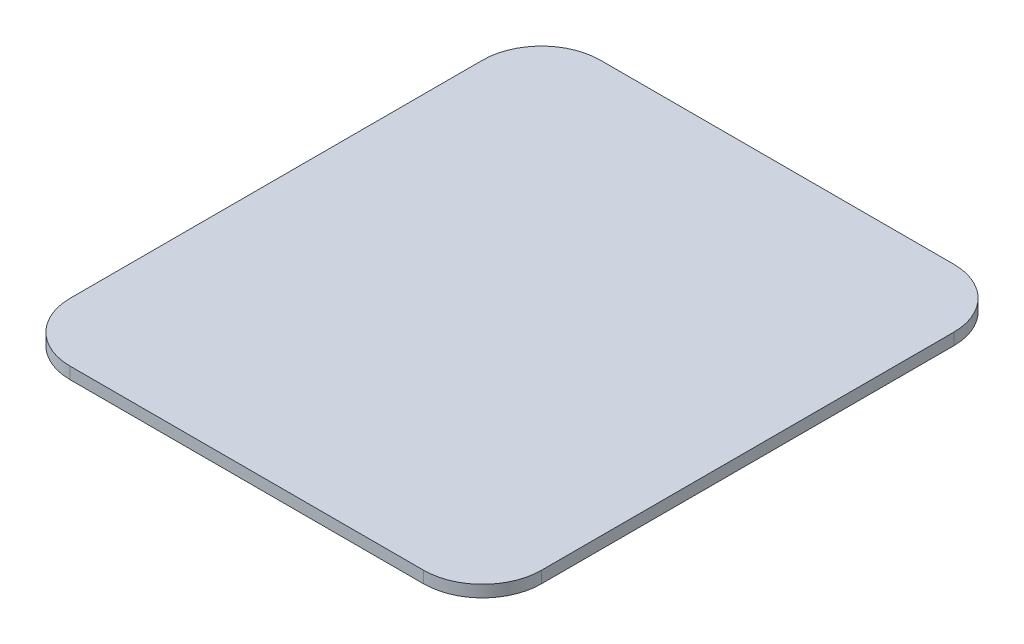
ISO-10303-21;
HEADER;
FILE_DESCRIPTION(('STEP AP214'),'2;1');
FILE_NAME('part.step','',(''),(''),'','','');
FILE_SCHEMA(('AUTOMOTIVE_DESIGN { 1 0 10303 214 1 1 1 1 }'));
ENDSEC;
DATA;
#1=APPLICATION_CONTEXT('core data for automotive mechanical design processes');
#2=APPLICATION_PROTOCOL_DEFINITION('international standard','automotive_design',2000,#1);
#3=PRODUCT_CONTEXT('',#1,'mechanical');
#4=PRODUCT('Part','Part','',(#3));
#5=PRODUCT_RELATED_PRODUCT_CATEGORY('part','',(#4));
#6=PRODUCT_DEFINITION_FORMATION('','',#4);
#7=PRODUCT_DEFINITION_CONTEXT('part definition',#1,'design');
#8=PRODUCT_DEFINITION('design','',#6,#7);
#9=PRODUCT_DEFINITION_SHAPE('','',#8);
#10=(LENGTH_UNIT() NAMED_UNIT(*) SI_UNIT(.MILLI.,.METRE.));
#11=(NAMED_UNIT(*) PLANE_ANGLE_UNIT() SI_UNIT($,.RADIAN.));
#12=(NAMED_UNIT(*) SI_UNIT($,.STERADIAN.) SOLID_ANGLE_UNIT());
#13=UNCERTAINTY_MEASURE_WITH_UNIT(LENGTH_MEASURE(1.E-05),#10,'distance_accuracy_value','');
#14=(GEOMETRIC_REPRESENTATION_CONTEXT(3) GLOBAL_UNCERTAINTY_ASSIGNED_CONTEXT((#13)) GLOBAL_UNIT_ASSIGNED_CONTEXT((#10,
#11,#12)) REPRESENTATION_CONTEXT('',''));
#15=CARTESIAN_POINT('',(0.,0.,0.));
#16=DIRECTION('',(0.,0.,1.));
#17=DIRECTION('',(1.,0.,0.));
#18=AXIS2_PLACEMENT_3D('',#15,#16,#17);
#19=CARTESIAN_POINT('',(-150.,10.,175.));
#20=DIRECTION('',(0.,-1.,0.));
#21=DIRECTION('',(0.,0.,-1.));
#22=AXIS2_PLACEMENT_3D('',#19,#20,#21);
#23=CYLINDRICAL_SURFACE('',#22,50.);
#24=CARTESIAN_POINT('',(-150.,0.,175.));
#25=DIRECTION('',(0.,1.,0.));
#26=DIRECTION('',(0.,0.,-1.));
#27=AXIS2_PLACEMENT_3D('',#24,#25,#26);
#28=CIRCLE('',#27,50.);
#29=CARTESIAN_POINT('',(-200.,0.,175.));
#30=VERTEX_POINT('',#29);
#31=CARTESIAN_POINT('',(-150.,0.,225.));
#32=VERTEX_POINT('',#31);
#33=EDGE_CURVE('E140',#30,#32,#28,.T.);
#34=ORIENTED_EDGE('',*,*,#33,.T.);
#35=DIRECTION('',(0.,-1.,0.));
#36=VECTOR('',#35,1.);
#37=CARTESIAN_POINT('',(-150.,10.,225.));
#38=LINE('',#37,#36);
#39=CARTESIAN_POINT('',(-150.,10.,225.));
#40=VERTEX_POINT('',#39);
#41=EDGE_CURVE('E11',#40,#32,#38,.T.);
#42=ORIENTED_EDGE('',*,*,#41,.F.);
#43=CARTESIAN_POINT('',(-150.,10.,175.));
#44=DIRECTION('',(0.,1.,0.));
#45=DIRECTION('',(0.,0.,-1.));
#46=AXIS2_PLACEMENT_3D('',#43,#44,#45);
#47=CIRCLE('',#46,50.);
#48=CARTESIAN_POINT('',(-200.,10.,175.));
#49=VERTEX_POINT('',#48);
#50=EDGE_CURVE('E162',#49,#40,#47,.T.);
#51=ORIENTED_EDGE('',*,*,#50,.F.);
#52=DIRECTION('',(0.,-1.,0.));
#53=VECTOR('',#52,1.);
#54=CARTESIAN_POINT('',(-200.,10.,175.));
#55=LINE('',#54,#53);
#56=EDGE_CURVE('E136',#49,#30,#55,.T.);
#57=ORIENTED_EDGE('',*,*,#56,.T.);
#58=EDGE_LOOP('',(#34,#42,#51,#57));
#59=FACE_BOUND('',#58,.T.);
#60=ADVANCED_FACE('F39',(#59),#23,.T.);
#61=CARTESIAN_POINT('',(-150.,10.,225.));
#62=DIRECTION('',(0.,0.,-1.));
#63=DIRECTION('',(-1.,0.,0.));
#64=AXIS2_PLACEMENT_3D('',#61,#62,#63);
#65=PLANE('',#64);
#66=DIRECTION('',(1.,0.,0.));
#67=VECTOR('',#66,1.);
#68=CARTESIAN_POINT('',(-150.,0.,225.));
#69=LINE('',#68,#67);
#70=CARTESIAN_POINT('',(150.,0.,225.));
#71=VERTEX_POINT('',#70);
#72=EDGE_CURVE('E144',#32,#71,#69,.T.);
#73=ORIENTED_EDGE('',*,*,#72,.T.);
#74=DIRECTION('',(0.,-1.,0.));
#75=VECTOR('',#74,1.);
#76=CARTESIAN_POINT('',(150.,10.,225.));
#77=LINE('',#76,#75);
#78=CARTESIAN_POINT('',(150.,10.,225.));
#79=VERTEX_POINT('',#78);
#80=EDGE_CURVE('E48',#79,#71,#77,.T.);
#81=ORIENTED_EDGE('',*,*,#80,.F.);
#82=DIRECTION('',(1.,0.,0.));
#83=VECTOR('',#82,1.);
#84=CARTESIAN_POINT('',(-150.,10.,225.));
#85=LINE('',#84,#83);
#86=EDGE_CURVE('E99',#40,#79,#85,.T.);
#87=ORIENTED_EDGE('',*,*,#86,.F.);
#88=ORIENTED_EDGE('',*,*,#41,.T.);
#89=EDGE_LOOP('',(#73,#81,#87,#88));
#90=FACE_BOUND('',#89,.T.);
#91=ADVANCED_FACE('F208',(#90),#65,.F.);
#92=CARTESIAN_POINT('',(150.,10.,175.));
#93=DIRECTION('',(0.,-1.,0.));
#94=DIRECTION('',(0.,0.,-1.));
#95=AXIS2_PLACEMENT_3D('',#92,#93,#94);
#96=CYLINDRICAL_SURFACE('',#95,50.);
#97=CARTESIAN_POINT('',(150.,0.,175.));
#98=DIRECTION('',(0.,1.,0.));
#99=DIRECTION('',(0.,0.,1.));
#100=AXIS2_PLACEMENT_3D('',#97,#98,#99);
#101=CIRCLE('',#100,50.);
#102=CARTESIAN_POINT('',(200.,0.,175.));
#103=VERTEX_POINT('',#102);
#104=EDGE_CURVE('E147',#71,#103,#101,.T.);
#105=ORIENTED_EDGE('',*,*,#104,.T.);
#106=DIRECTION('',(0.,-1.,0.));
#107=VECTOR('',#106,1.);
#108=CARTESIAN_POINT('',(200.,10.,175.));
#109=LINE('',#108,#107);
#110=CARTESIAN_POINT('',(200.,10.,175.));
#111=VERTEX_POINT('',#110);
#112=EDGE_CURVE('E173',#111,#103,#109,.T.);
#113=ORIENTED_EDGE('',*,*,#112,.F.);
#114=CARTESIAN_POINT('',(150.,10.,175.));
#115=DIRECTION('',(0.,1.,0.));
#116=DIRECTION('',(0.,0.,1.));
#117=AXIS2_PLACEMENT_3D('',#114,#115,#116);
#118=CIRCLE('',#117,50.);
#119=EDGE_CURVE('E183',#79,#111,#118,.T.);
#120=ORIENTED_EDGE('',*,*,#119,.F.);
#121=ORIENTED_EDGE('',*,*,#80,.T.);
#122=EDGE_LOOP('',(#105,#113,#120,#121));
#123=FACE_BOUND('',#122,.T.);
#124=ADVANCED_FACE('F181',(#123),#96,.T.);
#125=CARTESIAN_POINT('',(200.,10.,175.));
#126=DIRECTION('',(-1.,0.,0.));
#127=DIRECTION('',(0.,0.,1.));
#128=AXIS2_PLACEMENT_3D('',#125,#126,#127);
#129=PLANE('',#128);
#130=DIRECTION('',(0.,0.,-1.));
#131=VECTOR('',#130,1.);
#132=CARTESIAN_POINT('',(200.,0.,175.));
#133=LINE('',#132,#131);
#134=CARTESIAN_POINT('',(200.,0.,-175.));
#135=VERTEX_POINT('',#134);
#136=EDGE_CURVE('E150',#103,#135,#133,.T.);
#137=ORIENTED_EDGE('',*,*,#136,.T.);
#138=DIRECTION('',(0.,-1.,0.));
#139=VECTOR('',#138,1.);
#140=CARTESIAN_POINT('',(200.,10.,-175.));
#141=LINE('',#140,#139);
#142=CARTESIAN_POINT('',(200.,10.,-175.));
#143=VERTEX_POINT('',#142);
#144=EDGE_CURVE('E169',#143,#135,#141,.T.);
#145=ORIENTED_EDGE('',*,*,#144,.F.);
#146=DIRECTION('',(0.,0.,-1.));
#147=VECTOR('',#146,1.);
#148=CARTESIAN_POINT('',(200.,10.,175.));
#149=LINE('',#148,#147);
#150=EDGE_CURVE('E196',#111,#143,#149,.T.);
#151=ORIENTED_EDGE('',*,*,#150,.F.);
#152=ORIENTED_EDGE('',*,*,#112,.T.);
#153=EDGE_LOOP('',(#137,#145,#151,#152));
#154=FACE_BOUND('',#153,.T.);
#155=ADVANCED_FACE('F191',(#154),#129,.F.);
#156=CARTESIAN_POINT('',(150.,10.,-175.));
#157=DIRECTION('',(0.,-1.,0.));
#158=DIRECTION('',(0.,0.,-1.));
#159=AXIS2_PLACEMENT_3D('',#156,#157,#158);
#160=CYLINDRICAL_SURFACE('',#159,50.);
#161=CARTESIAN_POINT('',(150.,0.,-175.));
#162=DIRECTION('',(0.,1.,0.));
#163=DIRECTION('',(0.,0.,-1.));
#164=AXIS2_PLACEMENT_3D('',#161,#162,#163);
#165=CIRCLE('',#164,50.);
#166=CARTESIAN_POINT('',(150.,0.,-225.));
#167=VERTEX_POINT('',#166);
#168=EDGE_CURVE('E153',#135,#167,#165,.T.);
#169=ORIENTED_EDGE('',*,*,#168,.T.);
#170=DIRECTION('',(0.,-1.,0.));
#171=VECTOR('',#170,1.);
#172=CARTESIAN_POINT('',(150.,10.,-225.));
#173=LINE('',#172,#171);
#174=CARTESIAN_POINT('',(150.,10.,-225.));
#175=VERTEX_POINT('',#174);
#176=EDGE_CURVE('E129',#175,#167,#173,.T.);
#177=ORIENTED_EDGE('',*,*,#176,.F.);
#178=CARTESIAN_POINT('',(150.,10.,-175.));
#179=DIRECTION('',(0.,1.,0.));
#180=DIRECTION('',(0.,0.,-1.));
#181=AXIS2_PLACEMENT_3D('',#178,#179,#180);
#182=CIRCLE('',#181,50.);
#183=EDGE_CURVE('E118',#143,#175,#182,.T.);
#184=ORIENTED_EDGE('',*,*,#183,.F.);
#185=ORIENTED_EDGE('',*,*,#144,.T.);
#186=EDGE_LOOP('',(#169,#177,#184,#185));
#187=FACE_BOUND('',#186,.T.);
#188=ADVANCED_FACE('F194',(#187),#160,.T.);
#189=CARTESIAN_POINT('',(-150.,10.,-225.));
#190=DIRECTION('',(0.,0.,1.));
#191=DIRECTION('',(1.,0.,0.));
#192=AXIS2_PLACEMENT_3D('',#189,#190,#191);
#193=PLANE('',#192);
#194=DIRECTION('',(-1.,0.,0.));
#195=VECTOR('',#194,1.);
#196=CARTESIAN_POINT('',(-150.,0.,-225.));
#197=LINE('',#196,#195);
#198=CARTESIAN_POINT('',(-150.,0.,-225.));
#199=VERTEX_POINT('',#198);
#200=EDGE_CURVE('E127',#167,#199,#197,.T.);
#201=ORIENTED_EDGE('',*,*,#200,.T.);
#202=DIRECTION('',(0.,-1.,0.));
#203=VECTOR('',#202,1.);
#204=CARTESIAN_POINT('',(-150.,10.,-225.));
#205=LINE('',#204,#203);
#206=CARTESIAN_POINT('',(-150.,10.,-225.));
#207=VERTEX_POINT('',#206);
#208=EDGE_CURVE('E124',#207,#199,#205,.T.);
#209=ORIENTED_EDGE('',*,*,#208,.F.);
#210=DIRECTION('',(-1.,0.,0.));
#211=VECTOR('',#210,1.);
#212=CARTESIAN_POINT('',(-150.,10.,-225.));
#213=LINE('',#212,#211);
#214=EDGE_CURVE('E112',#175,#207,#213,.T.);
#215=ORIENTED_EDGE('',*,*,#214,.F.);
#216=ORIENTED_EDGE('',*,*,#176,.T.);
#217=EDGE_LOOP('',(#201,#209,#215,#216));
#218=FACE_BOUND('',#217,.T.);
#219=ADVANCED_FACE('F125',(#218),#193,.F.);
#220=CARTESIAN_POINT('',(-150.,10.,-175.));
#221=DIRECTION('',(0.,-1.,0.));
#222=DIRECTION('',(0.,0.,-1.));
#223=AXIS2_PLACEMENT_3D('',#220,#221,#222);
#224=CYLINDRICAL_SURFACE('',#223,50.);
#225=CARTESIAN_POINT('',(-150.,0.,-175.));
#226=DIRECTION('',(0.,1.,0.));
#227=DIRECTION('',(0.,0.,-1.));
#228=AXIS2_PLACEMENT_3D('',#225,#226,#227);
#229=CIRCLE('',#228,50.);
#230=CARTESIAN_POINT('',(-200.,0.,-175.));
#231=VERTEX_POINT('',#230);
#232=EDGE_CURVE('E85',#199,#231,#229,.T.);
#233=ORIENTED_EDGE('',*,*,#232,.T.);
#234=DIRECTION('',(0.,-1.,0.));
#235=VECTOR('',#234,1.);
#236=CARTESIAN_POINT('',(-200.,10.,-175.));
#237=LINE('',#236,#235);
#238=CARTESIAN_POINT('',(-200.,10.,-175.));
#239=VERTEX_POINT('',#238);
#240=EDGE_CURVE('E130',#239,#231,#237,.T.);
#241=ORIENTED_EDGE('',*,*,#240,.F.);
#242=CARTESIAN_POINT('',(-150.,10.,-175.));
#243=DIRECTION('',(0.,1.,0.));
#244=DIRECTION('',(0.,0.,-1.));
#245=AXIS2_PLACEMENT_3D('',#242,#243,#244);
#246=CIRCLE('',#245,50.);
#247=EDGE_CURVE('E116',#207,#239,#246,.T.);
#248=ORIENTED_EDGE('',*,*,#247,.F.);
#249=ORIENTED_EDGE('',*,*,#208,.T.);
#250=EDGE_LOOP('',(#233,#241,#248,#249));
#251=FACE_BOUND('',#250,.T.);
#252=ADVANCED_FACE('F132',(#251),#224,.T.);
#253=CARTESIAN_POINT('',(-200.,10.,175.));
#254=DIRECTION('',(1.,0.,0.));
#255=DIRECTION('',(0.,0.,-1.));
#256=AXIS2_PLACEMENT_3D('',#253,#254,#255);
#257=PLANE('',#256);
#258=DIRECTION('',(0.,0.,1.));
#259=VECTOR('',#258,1.);
#260=CARTESIAN_POINT('',(-200.,0.,175.));
#261=LINE('',#260,#259);
#262=EDGE_CURVE('E91',#231,#30,#261,.T.);
#263=ORIENTED_EDGE('',*,*,#262,.T.);
#264=ORIENTED_EDGE('',*,*,#56,.F.);
#265=DIRECTION('',(0.,0.,1.));
#266=VECTOR('',#265,1.);
#267=CARTESIAN_POINT('',(-200.,10.,175.));
#268=LINE('',#267,#266);
#269=EDGE_CURVE('E56',#239,#49,#268,.T.);
#270=ORIENTED_EDGE('',*,*,#269,.F.);
#271=ORIENTED_EDGE('',*,*,#240,.T.);
#272=EDGE_LOOP('',(#263,#264,#270,#271));
#273=FACE_BOUND('',#272,.T.);
#274=ADVANCED_FACE('F224',(#273),#257,.F.);
#275=CARTESIAN_POINT('',(-150.,10.,175.));
#276=DIRECTION('',(0.,-1.,0.));
#277=DIRECTION('',(0.,0.,-1.));
#278=AXIS2_PLACEMENT_3D('',#275,#276,#277);
#279=PLANE('',#278);
#280=ORIENTED_EDGE('',*,*,#50,.T.);
#281=ORIENTED_EDGE('',*,*,#86,.T.);
#282=ORIENTED_EDGE('',*,*,#119,.T.);
#283=ORIENTED_EDGE('',*,*,#150,.T.);
#284=ORIENTED_EDGE('',*,*,#183,.T.);
#285=ORIENTED_EDGE('',*,*,#214,.T.);
#286=ORIENTED_EDGE('',*,*,#247,.T.);
#287=ORIENTED_EDGE('',*,*,#269,.T.);
#288=EDGE_LOOP('',(#280,#281,#282,#283,#284,#285,#286,#287));
#289=FACE_BOUND('',#288,.T.);
#290=ADVANCED_FACE('F114',(#289),#279,.F.);
#291=CARTESIAN_POINT('',(-150.,0.,175.));
#292=DIRECTION('',(0.,-1.,0.));
#293=DIRECTION('',(0.,0.,-1.));
#294=AXIS2_PLACEMENT_3D('',#291,#292,#293);
#295=PLANE('',#294);
#296=ORIENTED_EDGE('',*,*,#33,.F.);
#297=ORIENTED_EDGE('',*,*,#262,.F.);
#298=ORIENTED_EDGE('',*,*,#232,.F.);
#299=ORIENTED_EDGE('',*,*,#200,.F.);
#300=ORIENTED_EDGE('',*,*,#168,.F.);
#301=ORIENTED_EDGE('',*,*,#136,.F.);
#302=ORIENTED_EDGE('',*,*,#104,.F.);
#303=ORIENTED_EDGE('',*,*,#72,.F.);
#304=EDGE_LOOP('',(#296,#297,#298,#299,#300,#301,#302,#303));
#305=FACE_BOUND('',#304,.T.);
#306=ADVANCED_FACE('F187',(#305),#295,.T.);
#307=CLOSED_SHELL('',(#60,#91,#124,#155,#188,#219,#252,#274,#290,#306));
#308=MANIFOLD_SOLID_BREP('B2',#307);
#309=ADVANCED_BREP_SHAPE_REPRESENTATION('',(#18,#308),#14);
#310=SHAPE_DEFINITION_REPRESENTATION(#9,#309);
ENDSEC;
END-ISO-10303-21;
